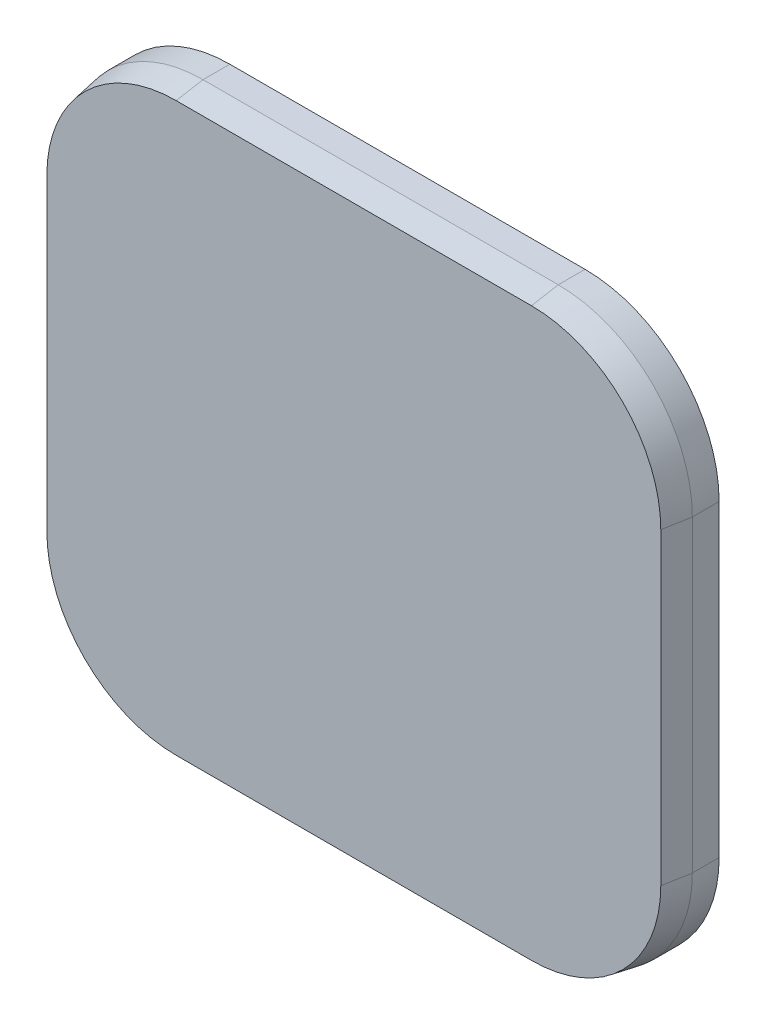
ISO-10303-21;
HEADER;
FILE_DESCRIPTION(('STEP AP214'),'2;1');
FILE_NAME('part.step','',(''),(''),'','','');
FILE_SCHEMA(('AUTOMOTIVE_DESIGN { 1 0 10303 214 1 1 1 1 }'));
ENDSEC;
DATA;
#1=APPLICATION_CONTEXT('core data for automotive mechanical design processes');
#2=APPLICATION_PROTOCOL_DEFINITION('international standard','automotive_design',2000,#1);
#3=PRODUCT_CONTEXT('',#1,'mechanical');
#4=PRODUCT('Part','Part','',(#3));
#5=PRODUCT_RELATED_PRODUCT_CATEGORY('part','',(#4));
#6=PRODUCT_DEFINITION_FORMATION('','',#4);
#7=PRODUCT_DEFINITION_CONTEXT('part definition',#1,'design');
#8=PRODUCT_DEFINITION('design','',#6,#7);
#9=PRODUCT_DEFINITION_SHAPE('','',#8);
#10=(LENGTH_UNIT() NAMED_UNIT(*) SI_UNIT(.MILLI.,.METRE.));
#11=(NAMED_UNIT(*) PLANE_ANGLE_UNIT() SI_UNIT($,.RADIAN.));
#12=(NAMED_UNIT(*) SI_UNIT($,.STERADIAN.) SOLID_ANGLE_UNIT());
#13=UNCERTAINTY_MEASURE_WITH_UNIT(LENGTH_MEASURE(1.E-05),#10,'distance_accuracy_value','');
#14=(GEOMETRIC_REPRESENTATION_CONTEXT(3) GLOBAL_UNCERTAINTY_ASSIGNED_CONTEXT((#13)) GLOBAL_UNIT_ASSIGNED_CONTEXT((#10,
#11,#12)) REPRESENTATION_CONTEXT('',''));
#15=CARTESIAN_POINT('',(0.,0.,0.));
#16=DIRECTION('',(0.,0.,1.));
#17=DIRECTION('',(1.,0.,0.));
#18=AXIS2_PLACEMENT_3D('',#15,#16,#17);
#19=CARTESIAN_POINT('',(-36.5,33.,0.));
#20=DIRECTION('',(0.,0.,-1.));
#21=DIRECTION('',(1.,0.,0.));
#22=AXIS2_PLACEMENT_3D('',#19,#20,#21);
#23=CONICAL_SURFACE('',#22,10.,0.174532925199433);
#24=CARTESIAN_POINT('',(-36.5,33.,0.));
#25=DIRECTION('',(0.,0.,1.));
#26=DIRECTION('',(1.,0.,0.));
#27=AXIS2_PLACEMENT_3D('',#24,#25,#26);
#28=CIRCLE('',#27,10.);
#29=CARTESIAN_POINT('',(-36.4999999999999,43.,0.));
#30=VERTEX_POINT('',#29);
#31=CARTESIAN_POINT('',(-46.5,32.9999999999999,0.));
#32=VERTEX_POINT('',#31);
#33=EDGE_CURVE('E166',#30,#32,#28,.T.);
#34=ORIENTED_EDGE('',*,*,#33,.T.);
#35=DIRECTION('',(-0.17364817766693,0.,-0.984807753012208));
#36=VECTOR('',#35,1.);
#37=CARTESIAN_POINT('',(-46.5,32.9999999999999,0.));
#38=LINE('',#37,#36);
#39=CARTESIAN_POINT('',(-46.1473460385831,32.9999999999999,2.));
#40=VERTEX_POINT('',#39);
#41=EDGE_CURVE('E11',#40,#32,#38,.T.);
#42=ORIENTED_EDGE('',*,*,#41,.F.);
#43=CARTESIAN_POINT('',(-36.5,33.,2.));
#44=DIRECTION('',(0.,0.,1.));
#45=DIRECTION('',(1.,0.,0.));
#46=AXIS2_PLACEMENT_3D('',#43,#44,#45);
#47=CIRCLE('',#46,9.64734603858307);
#48=CARTESIAN_POINT('',(-36.4999999999999,42.6473460385831,2.));
#49=VERTEX_POINT('',#48);
#50=EDGE_CURVE('E198',#49,#40,#47,.T.);
#51=ORIENTED_EDGE('',*,*,#50,.F.);
#52=DIRECTION('',(0.,0.17364817766693,-0.984807753012208));
#53=VECTOR('',#52,1.);
#54=CARTESIAN_POINT('',(-36.4999999999999,43.,0.));
#55=LINE('',#54,#53);
#56=EDGE_CURVE('E200',#49,#30,#55,.T.);
#57=ORIENTED_EDGE('',*,*,#56,.T.);
#58=EDGE_LOOP('',(#34,#42,#51,#57));
#59=FACE_BOUND('',#58,.T.);
#60=ADVANCED_FACE('F33',(#59),#23,.T.);
#61=CARTESIAN_POINT('',(-46.5,10.0000000000001,0.));
#62=DIRECTION('',(-0.984807753012208,0.,0.17364817766693));
#63=DIRECTION('',(0.17364817766693,0.,0.984807753012208));
#64=AXIS2_PLACEMENT_3D('',#61,#62,#63);
#65=PLANE('',#64);
#66=DIRECTION('',(0.,-1.,0.));
#67=VECTOR('',#66,1.);
#68=CARTESIAN_POINT('',(-46.5,10.0000000000001,0.));
#69=LINE('',#68,#67);
#70=CARTESIAN_POINT('',(-46.5,9.99999999999999,0.));
#71=VERTEX_POINT('',#70);
#72=EDGE_CURVE('E129',#32,#71,#69,.T.);
#73=ORIENTED_EDGE('',*,*,#72,.T.);
#74=DIRECTION('',(-0.17364817766693,0.,-0.984807753012208));
#75=VECTOR('',#74,1.);
#76=CARTESIAN_POINT('',(-46.5,9.99999999999999,0.));
#77=LINE('',#76,#75);
#78=CARTESIAN_POINT('',(-46.1473460385831,9.99999999999999,2.));
#79=VERTEX_POINT('',#78);
#80=EDGE_CURVE('E42',#79,#71,#77,.T.);
#81=ORIENTED_EDGE('',*,*,#80,.F.);
#82=DIRECTION('',(0.,1.,0.));
#83=VECTOR('',#82,1.);
#84=CARTESIAN_POINT('',(-46.1473460385831,10.0000000000001,2.));
#85=LINE('',#84,#83);
#86=EDGE_CURVE('E221',#40,#79,#85,.F.);
#87=ORIENTED_EDGE('',*,*,#86,.F.);
#88=ORIENTED_EDGE('',*,*,#41,.T.);
#89=EDGE_LOOP('',(#73,#81,#87,#88));
#90=FACE_BOUND('',#89,.T.);
#91=ADVANCED_FACE('F35',(#90),#65,.T.);
#92=CARTESIAN_POINT('',(-36.5,9.99999999999999,0.));
#93=DIRECTION('',(0.,0.,-1.));
#94=DIRECTION('',(-1.,0.,0.));
#95=AXIS2_PLACEMENT_3D('',#92,#93,#94);
#96=CONICAL_SURFACE('',#95,10.,0.174532925199433);
#97=CARTESIAN_POINT('',(-36.5,9.99999999999999,0.));
#98=DIRECTION('',(0.,0.,1.));
#99=DIRECTION('',(-1.,0.,0.));
#100=AXIS2_PLACEMENT_3D('',#97,#98,#99);
#101=CIRCLE('',#100,10.);
#102=CARTESIAN_POINT('',(-36.4999999999999,0.,0.));
#103=VERTEX_POINT('',#102);
#104=EDGE_CURVE('E181',#71,#103,#101,.T.);
#105=ORIENTED_EDGE('',*,*,#104,.T.);
#106=DIRECTION('',(0.,-0.17364817766693,-0.984807753012208));
#107=VECTOR('',#106,1.);
#108=CARTESIAN_POINT('',(-36.4999999999999,0.,0.));
#109=LINE('',#108,#107);
#110=CARTESIAN_POINT('',(-36.4999999999999,0.352653961416924,2.));
#111=VERTEX_POINT('',#110);
#112=EDGE_CURVE('E215',#111,#103,#109,.T.);
#113=ORIENTED_EDGE('',*,*,#112,.F.);
#114=CARTESIAN_POINT('',(-36.5,9.99999999999999,2.));
#115=DIRECTION('',(0.,0.,1.));
#116=DIRECTION('',(1.,0.,0.));
#117=AXIS2_PLACEMENT_3D('',#114,#115,#116);
#118=CIRCLE('',#117,9.64734603858307);
#119=EDGE_CURVE('E223',#79,#111,#118,.T.);
#120=ORIENTED_EDGE('',*,*,#119,.F.);
#121=ORIENTED_EDGE('',*,*,#80,.T.);
#122=EDGE_LOOP('',(#105,#113,#120,#121));
#123=FACE_BOUND('',#122,.T.);
#124=ADVANCED_FACE('F252',(#123),#96,.T.);
#125=CARTESIAN_POINT('',(-10.0000000000001,0.,0.));
#126=DIRECTION('',(0.,-0.984807753012208,0.17364817766693));
#127=DIRECTION('',(0.,-0.17364817766693,-0.984807753012208));
#128=AXIS2_PLACEMENT_3D('',#125,#126,#127);
#129=PLANE('',#128);
#130=DIRECTION('',(1.,0.,0.));
#131=VECTOR('',#130,1.);
#132=CARTESIAN_POINT('',(-10.0000000000001,0.,0.));
#133=LINE('',#132,#131);
#134=CARTESIAN_POINT('',(-10.0000000000001,0.,0.));
#135=VERTEX_POINT('',#134);
#136=EDGE_CURVE('E184',#103,#135,#133,.T.);
#137=ORIENTED_EDGE('',*,*,#136,.T.);
#138=DIRECTION('',(0.,-0.17364817766693,-0.984807753012208));
#139=VECTOR('',#138,1.);
#140=CARTESIAN_POINT('',(-10.0000000000001,0.,0.));
#141=LINE('',#140,#139);
#142=CARTESIAN_POINT('',(-10.0000000000001,0.352653961416928,2.));
#143=VERTEX_POINT('',#142);
#144=EDGE_CURVE('E212',#143,#135,#141,.T.);
#145=ORIENTED_EDGE('',*,*,#144,.F.);
#146=DIRECTION('',(-1.,0.,0.));
#147=VECTOR('',#146,1.);
#148=CARTESIAN_POINT('',(-10.0000000000001,0.352653961416928,2.));
#149=LINE('',#148,#147);
#150=EDGE_CURVE('E225',#111,#143,#149,.F.);
#151=ORIENTED_EDGE('',*,*,#150,.F.);
#152=ORIENTED_EDGE('',*,*,#112,.T.);
#153=EDGE_LOOP('',(#137,#145,#151,#152));
#154=FACE_BOUND('',#153,.T.);
#155=ADVANCED_FACE('F256',(#154),#129,.T.);
#156=CARTESIAN_POINT('',(-10.,10.,0.));
#157=DIRECTION('',(0.,0.,-1.));
#158=DIRECTION('',(1.,0.,0.));
#159=AXIS2_PLACEMENT_3D('',#156,#157,#158);
#160=CONICAL_SURFACE('',#159,10.,0.174532925199433);
#161=CARTESIAN_POINT('',(-10.,10.,0.));
#162=DIRECTION('',(0.,0.,1.));
#163=DIRECTION('',(1.,0.,0.));
#164=AXIS2_PLACEMENT_3D('',#161,#162,#163);
#165=CIRCLE('',#164,10.);
#166=CARTESIAN_POINT('',(0.,10.0000000000001,0.));
#167=VERTEX_POINT('',#166);
#168=EDGE_CURVE('E187',#135,#167,#165,.T.);
#169=ORIENTED_EDGE('',*,*,#168,.T.);
#170=DIRECTION('',(0.17364817766693,0.,-0.984807753012208));
#171=VECTOR('',#170,1.);
#172=CARTESIAN_POINT('',(0.,10.0000000000001,0.));
#173=LINE('',#172,#171);
#174=CARTESIAN_POINT('',(-0.35265396141693,10.0000000000001,2.));
#175=VERTEX_POINT('',#174);
#176=EDGE_CURVE('E209',#175,#167,#173,.T.);
#177=ORIENTED_EDGE('',*,*,#176,.F.);
#178=CARTESIAN_POINT('',(-10.,10.,2.));
#179=DIRECTION('',(0.,0.,1.));
#180=DIRECTION('',(1.,0.,0.));
#181=AXIS2_PLACEMENT_3D('',#178,#179,#180);
#182=CIRCLE('',#181,9.64734603858307);
#183=EDGE_CURVE('E227',#143,#175,#182,.T.);
#184=ORIENTED_EDGE('',*,*,#183,.F.);
#185=ORIENTED_EDGE('',*,*,#144,.T.);
#186=EDGE_LOOP('',(#169,#177,#184,#185));
#187=FACE_BOUND('',#186,.T.);
#188=ADVANCED_FACE('F259',(#187),#160,.T.);
#189=CARTESIAN_POINT('',(0.,10.0000000000001,0.));
#190=DIRECTION('',(0.984807753012208,0.,0.17364817766693));
#191=DIRECTION('',(0.17364817766693,0.,-0.984807753012208));
#192=AXIS2_PLACEMENT_3D('',#189,#190,#191);
#193=PLANE('',#192);
#194=DIRECTION('',(0.,1.,0.));
#195=VECTOR('',#194,1.);
#196=CARTESIAN_POINT('',(0.,10.0000000000001,0.));
#197=LINE('',#196,#195);
#198=CARTESIAN_POINT('',(0.,32.9999999999999,0.));
#199=VERTEX_POINT('',#198);
#200=EDGE_CURVE('E190',#167,#199,#197,.T.);
#201=ORIENTED_EDGE('',*,*,#200,.T.);
#202=DIRECTION('',(0.17364817766693,0.,-0.984807753012208));
#203=VECTOR('',#202,1.);
#204=CARTESIAN_POINT('',(0.,32.9999999999999,0.));
#205=LINE('',#204,#203);
#206=CARTESIAN_POINT('',(-0.35265396141693,32.9999999999999,2.));
#207=VERTEX_POINT('',#206);
#208=EDGE_CURVE('E206',#207,#199,#205,.T.);
#209=ORIENTED_EDGE('',*,*,#208,.F.);
#210=DIRECTION('',(0.,-1.,0.));
#211=VECTOR('',#210,1.);
#212=CARTESIAN_POINT('',(-0.35265396141693,10.0000000000001,2.));
#213=LINE('',#212,#211);
#214=EDGE_CURVE('E229',#175,#207,#213,.F.);
#215=ORIENTED_EDGE('',*,*,#214,.F.);
#216=ORIENTED_EDGE('',*,*,#176,.T.);
#217=EDGE_LOOP('',(#201,#209,#215,#216));
#218=FACE_BOUND('',#217,.T.);
#219=ADVANCED_FACE('F236',(#218),#193,.T.);
#220=CARTESIAN_POINT('',(-10.,33.,0.));
#221=DIRECTION('',(0.,0.,-1.));
#222=DIRECTION('',(1.,0.,0.));
#223=AXIS2_PLACEMENT_3D('',#220,#221,#222);
#224=CONICAL_SURFACE('',#223,10.,0.174532925199433);
#225=CARTESIAN_POINT('',(-10.,33.,0.));
#226=DIRECTION('',(0.,0.,1.));
#227=DIRECTION('',(1.,0.,0.));
#228=AXIS2_PLACEMENT_3D('',#225,#226,#227);
#229=CIRCLE('',#228,10.);
#230=CARTESIAN_POINT('',(-10.0000000000001,43.,0.));
#231=VERTEX_POINT('',#230);
#232=EDGE_CURVE('E193',#199,#231,#229,.T.);
#233=ORIENTED_EDGE('',*,*,#232,.T.);
#234=DIRECTION('',(0.,0.17364817766693,-0.984807753012208));
#235=VECTOR('',#234,1.);
#236=CARTESIAN_POINT('',(-10.0000000000001,43.,0.));
#237=LINE('',#236,#235);
#238=CARTESIAN_POINT('',(-10.0000000000001,42.6473460385831,2.));
#239=VERTEX_POINT('',#238);
#240=EDGE_CURVE('E203',#239,#231,#237,.T.);
#241=ORIENTED_EDGE('',*,*,#240,.F.);
#242=CARTESIAN_POINT('',(-10.,33.,2.));
#243=DIRECTION('',(0.,0.,1.));
#244=DIRECTION('',(1.,0.,0.));
#245=AXIS2_PLACEMENT_3D('',#242,#243,#244);
#246=CIRCLE('',#245,9.64734603858307);
#247=EDGE_CURVE('E54',#207,#239,#246,.T.);
#248=ORIENTED_EDGE('',*,*,#247,.F.);
#249=ORIENTED_EDGE('',*,*,#208,.T.);
#250=EDGE_LOOP('',(#233,#241,#248,#249));
#251=FACE_BOUND('',#250,.T.);
#252=ADVANCED_FACE('F239',(#251),#224,.T.);
#253=CARTESIAN_POINT('',(-10.0000000000001,43.,0.));
#254=DIRECTION('',(0.,0.984807753012208,0.17364817766693));
#255=DIRECTION('',(0.,-0.17364817766693,0.984807753012208));
#256=AXIS2_PLACEMENT_3D('',#253,#254,#255);
#257=PLANE('',#256);
#258=DIRECTION('',(-1.,0.,0.));
#259=VECTOR('',#258,1.);
#260=CARTESIAN_POINT('',(-10.0000000000001,43.,0.));
#261=LINE('',#260,#259);
#262=EDGE_CURVE('E196',#231,#30,#261,.T.);
#263=ORIENTED_EDGE('',*,*,#262,.T.);
#264=ORIENTED_EDGE('',*,*,#56,.F.);
#265=DIRECTION('',(1.,0.,0.));
#266=VECTOR('',#265,1.);
#267=CARTESIAN_POINT('',(-10.0000000000001,42.6473460385831,2.));
#268=LINE('',#267,#266);
#269=EDGE_CURVE('E37',#239,#49,#268,.F.);
#270=ORIENTED_EDGE('',*,*,#269,.F.);
#271=ORIENTED_EDGE('',*,*,#240,.T.);
#272=EDGE_LOOP('',(#263,#264,#270,#271));
#273=FACE_BOUND('',#272,.T.);
#274=ADVANCED_FACE('F242',(#273),#257,.T.);
#275=CARTESIAN_POINT('',(-36.5,33.,2.));
#276=DIRECTION('',(0.,0.,1.));
#277=DIRECTION('',(1.,0.,0.));
#278=AXIS2_PLACEMENT_3D('',#275,#276,#277);
#279=PLANE('',#278);
#280=ORIENTED_EDGE('',*,*,#50,.T.);
#281=ORIENTED_EDGE('',*,*,#86,.T.);
#282=ORIENTED_EDGE('',*,*,#119,.T.);
#283=ORIENTED_EDGE('',*,*,#150,.T.);
#284=ORIENTED_EDGE('',*,*,#183,.T.);
#285=ORIENTED_EDGE('',*,*,#214,.T.);
#286=ORIENTED_EDGE('',*,*,#247,.T.);
#287=ORIENTED_EDGE('',*,*,#269,.T.);
#288=EDGE_LOOP('',(#280,#281,#282,#283,#284,#285,#286,#287));
#289=FACE_BOUND('',#288,.T.);
#290=ADVANCED_FACE('F232',(#289),#279,.T.);
#291=CARTESIAN_POINT('',(-36.5,33.,-2.));
#292=DIRECTION('',(0.,0.,1.));
#293=DIRECTION('',(1.,0.,0.));
#294=AXIS2_PLACEMENT_3D('',#291,#292,#293);
#295=CYLINDRICAL_SURFACE('',#294,10.);
#296=ORIENTED_EDGE('',*,*,#33,.F.);
#297=DIRECTION('',(0.,0.,1.));
#298=VECTOR('',#297,1.);
#299=CARTESIAN_POINT('',(-36.4999999999999,43.,-2.));
#300=LINE('',#299,#298);
#301=CARTESIAN_POINT('',(-36.4999999999999,43.,-2.));
#302=VERTEX_POINT('',#301);
#303=EDGE_CURVE('E148',#302,#30,#300,.T.);
#304=ORIENTED_EDGE('',*,*,#303,.F.);
#305=CARTESIAN_POINT('',(-36.5,33.,-2.));
#306=DIRECTION('',(0.,0.,1.));
#307=DIRECTION('',(1.,0.,0.));
#308=AXIS2_PLACEMENT_3D('',#305,#306,#307);
#309=CIRCLE('',#308,10.);
#310=CARTESIAN_POINT('',(-46.5,32.9999999999999,-2.));
#311=VERTEX_POINT('',#310);
#312=EDGE_CURVE('E141',#302,#311,#309,.T.);
#313=ORIENTED_EDGE('',*,*,#312,.T.);
#314=DIRECTION('',(0.,0.,1.));
#315=VECTOR('',#314,1.);
#316=CARTESIAN_POINT('',(-46.5,32.9999999999999,-2.));
#317=LINE('',#316,#315);
#318=EDGE_CURVE('E123',#311,#32,#317,.T.);
#319=ORIENTED_EDGE('',*,*,#318,.T.);
#320=EDGE_LOOP('',(#296,#304,#313,#319));
#321=FACE_BOUND('',#320,.T.);
#322=ADVANCED_FACE('F147',(#321),#295,.T.);
#323=CARTESIAN_POINT('',(-10.0000000000001,43.,-2.));
#324=DIRECTION('',(0.,1.,0.));
#325=DIRECTION('',(-1.,0.,0.));
#326=AXIS2_PLACEMENT_3D('',#323,#324,#325);
#327=PLANE('',#326);
#328=ORIENTED_EDGE('',*,*,#262,.F.);
#329=DIRECTION('',(0.,0.,1.));
#330=VECTOR('',#329,1.);
#331=CARTESIAN_POINT('',(-10.0000000000001,43.,-2.));
#332=LINE('',#331,#330);
#333=CARTESIAN_POINT('',(-10.0000000000001,43.,-2.));
#334=VERTEX_POINT('',#333);
#335=EDGE_CURVE('E167',#334,#231,#332,.T.);
#336=ORIENTED_EDGE('',*,*,#335,.F.);
#337=DIRECTION('',(-1.,0.,0.));
#338=VECTOR('',#337,1.);
#339=CARTESIAN_POINT('',(-10.0000000000001,43.,-2.));
#340=LINE('',#339,#338);
#341=EDGE_CURVE('E134',#334,#302,#340,.T.);
#342=ORIENTED_EDGE('',*,*,#341,.T.);
#343=ORIENTED_EDGE('',*,*,#303,.T.);
#344=EDGE_LOOP('',(#328,#336,#342,#343));
#345=FACE_BOUND('',#344,.T.);
#346=ADVANCED_FACE('F271',(#345),#327,.T.);
#347=CARTESIAN_POINT('',(-10.,33.,-2.));
#348=DIRECTION('',(0.,0.,1.));
#349=DIRECTION('',(1.,0.,0.));
#350=AXIS2_PLACEMENT_3D('',#347,#348,#349);
#351=CYLINDRICAL_SURFACE('',#350,10.);
#352=ORIENTED_EDGE('',*,*,#232,.F.);
#353=DIRECTION('',(0.,0.,1.));
#354=VECTOR('',#353,1.);
#355=CARTESIAN_POINT('',(0.,32.9999999999999,-2.));
#356=LINE('',#355,#354);
#357=CARTESIAN_POINT('',(0.,32.9999999999999,-2.));
#358=VERTEX_POINT('',#357);
#359=EDGE_CURVE('E169',#358,#199,#356,.T.);
#360=ORIENTED_EDGE('',*,*,#359,.F.);
#361=CARTESIAN_POINT('',(-10.,33.,-2.));
#362=DIRECTION('',(0.,0.,1.));
#363=DIRECTION('',(1.,0.,0.));
#364=AXIS2_PLACEMENT_3D('',#361,#362,#363);
#365=CIRCLE('',#364,10.);
#366=EDGE_CURVE('E161',#358,#334,#365,.T.);
#367=ORIENTED_EDGE('',*,*,#366,.T.);
#368=ORIENTED_EDGE('',*,*,#335,.T.);
#369=EDGE_LOOP('',(#352,#360,#367,#368));
#370=FACE_BOUND('',#369,.T.);
#371=ADVANCED_FACE('F269',(#370),#351,.T.);
#372=CARTESIAN_POINT('',(0.,10.0000000000001,-2.));
#373=DIRECTION('',(1.,0.,0.));
#374=DIRECTION('',(0.,0.,-1.));
#375=AXIS2_PLACEMENT_3D('',#372,#373,#374);
#376=PLANE('',#375);
#377=ORIENTED_EDGE('',*,*,#200,.F.);
#378=DIRECTION('',(0.,0.,1.));
#379=VECTOR('',#378,1.);
#380=CARTESIAN_POINT('',(0.,10.0000000000001,-2.));
#381=LINE('',#380,#379);
#382=CARTESIAN_POINT('',(0.,10.0000000000001,-2.));
#383=VERTEX_POINT('',#382);
#384=EDGE_CURVE('E171',#383,#167,#381,.T.);
#385=ORIENTED_EDGE('',*,*,#384,.F.);
#386=DIRECTION('',(0.,1.,0.));
#387=VECTOR('',#386,1.);
#388=CARTESIAN_POINT('',(0.,10.0000000000001,-2.));
#389=LINE('',#388,#387);
#390=EDGE_CURVE('E158',#383,#358,#389,.T.);
#391=ORIENTED_EDGE('',*,*,#390,.T.);
#392=ORIENTED_EDGE('',*,*,#359,.T.);
#393=EDGE_LOOP('',(#377,#385,#391,#392));
#394=FACE_BOUND('',#393,.T.);
#395=ADVANCED_FACE('F266',(#394),#376,.T.);
#396=CARTESIAN_POINT('',(-10.,10.,-2.));
#397=DIRECTION('',(0.,0.,1.));
#398=DIRECTION('',(1.,0.,0.));
#399=AXIS2_PLACEMENT_3D('',#396,#397,#398);
#400=CYLINDRICAL_SURFACE('',#399,10.);
#401=ORIENTED_EDGE('',*,*,#168,.F.);
#402=DIRECTION('',(0.,0.,1.));
#403=VECTOR('',#402,1.);
#404=CARTESIAN_POINT('',(-10.0000000000001,0.,-2.));
#405=LINE('',#404,#403);
#406=CARTESIAN_POINT('',(-10.0000000000001,0.,-2.));
#407=VERTEX_POINT('',#406);
#408=EDGE_CURVE('E173',#407,#135,#405,.T.);
#409=ORIENTED_EDGE('',*,*,#408,.F.);
#410=CARTESIAN_POINT('',(-10.,10.,-2.));
#411=DIRECTION('',(0.,0.,1.));
#412=DIRECTION('',(1.,0.,0.));
#413=AXIS2_PLACEMENT_3D('',#410,#411,#412);
#414=CIRCLE('',#413,10.);
#415=EDGE_CURVE('E155',#407,#383,#414,.T.);
#416=ORIENTED_EDGE('',*,*,#415,.T.);
#417=ORIENTED_EDGE('',*,*,#384,.T.);
#418=EDGE_LOOP('',(#401,#409,#416,#417));
#419=FACE_BOUND('',#418,.T.);
#420=ADVANCED_FACE('F262',(#419),#400,.T.);
#421=CARTESIAN_POINT('',(-10.0000000000001,0.,-2.));
#422=DIRECTION('',(0.,-1.,0.));
#423=DIRECTION('',(1.,0.,0.));
#424=AXIS2_PLACEMENT_3D('',#421,#422,#423);
#425=PLANE('',#424);
#426=ORIENTED_EDGE('',*,*,#136,.F.);
#427=DIRECTION('',(0.,0.,1.));
#428=VECTOR('',#427,1.);
#429=CARTESIAN_POINT('',(-36.4999999999999,0.,-2.));
#430=LINE('',#429,#428);
#431=CARTESIAN_POINT('',(-36.4999999999999,0.,-2.));
#432=VERTEX_POINT('',#431);
#433=EDGE_CURVE('E175',#432,#103,#430,.T.);
#434=ORIENTED_EDGE('',*,*,#433,.F.);
#435=DIRECTION('',(1.,0.,0.));
#436=VECTOR('',#435,1.);
#437=CARTESIAN_POINT('',(-10.0000000000001,0.,-2.));
#438=LINE('',#437,#436);
#439=EDGE_CURVE('E152',#432,#407,#438,.T.);
#440=ORIENTED_EDGE('',*,*,#439,.T.);
#441=ORIENTED_EDGE('',*,*,#408,.T.);
#442=EDGE_LOOP('',(#426,#434,#440,#441));
#443=FACE_BOUND('',#442,.T.);
#444=ADVANCED_FACE('F273',(#443),#425,.T.);
#445=CARTESIAN_POINT('',(-36.5,9.99999999999999,-2.));
#446=DIRECTION('',(0.,0.,1.));
#447=DIRECTION('',(1.,0.,0.));
#448=AXIS2_PLACEMENT_3D('',#445,#446,#447);
#449=CYLINDRICAL_SURFACE('',#448,10.);
#450=ORIENTED_EDGE('',*,*,#104,.F.);
#451=DIRECTION('',(0.,0.,1.));
#452=VECTOR('',#451,1.);
#453=CARTESIAN_POINT('',(-46.5,9.99999999999999,-2.));
#454=LINE('',#453,#452);
#455=CARTESIAN_POINT('',(-46.5,9.99999999999999,-2.));
#456=VERTEX_POINT('',#455);
#457=EDGE_CURVE('E133',#456,#71,#454,.T.);
#458=ORIENTED_EDGE('',*,*,#457,.F.);
#459=CARTESIAN_POINT('',(-36.5,9.99999999999999,-2.));
#460=DIRECTION('',(0.,0.,1.));
#461=DIRECTION('',(-1.,0.,0.));
#462=AXIS2_PLACEMENT_3D('',#459,#460,#461);
#463=CIRCLE('',#462,10.);
#464=EDGE_CURVE('E145',#456,#432,#463,.T.);
#465=ORIENTED_EDGE('',*,*,#464,.T.);
#466=ORIENTED_EDGE('',*,*,#433,.T.);
#467=EDGE_LOOP('',(#450,#458,#465,#466));
#468=FACE_BOUND('',#467,.T.);
#469=ADVANCED_FACE('F275',(#468),#449,.T.);
#470=CARTESIAN_POINT('',(-46.5,10.0000000000001,-2.));
#471=DIRECTION('',(-1.,0.,0.));
#472=DIRECTION('',(0.,0.,1.));
#473=AXIS2_PLACEMENT_3D('',#470,#471,#472);
#474=PLANE('',#473);
#475=ORIENTED_EDGE('',*,*,#72,.F.);
#476=ORIENTED_EDGE('',*,*,#318,.F.);
#477=DIRECTION('',(0.,-1.,0.));
#478=VECTOR('',#477,1.);
#479=CARTESIAN_POINT('',(-46.5,10.0000000000001,-2.));
#480=LINE('',#479,#478);
#481=EDGE_CURVE('E127',#311,#456,#480,.T.);
#482=ORIENTED_EDGE('',*,*,#481,.T.);
#483=ORIENTED_EDGE('',*,*,#457,.T.);
#484=EDGE_LOOP('',(#475,#476,#482,#483));
#485=FACE_BOUND('',#484,.T.);
#486=ADVANCED_FACE('F125',(#485),#474,.T.);
#487=CARTESIAN_POINT('',(-36.5,33.,-2.));
#488=DIRECTION('',(0.,0.,1.));
#489=DIRECTION('',(1.,0.,0.));
#490=AXIS2_PLACEMENT_3D('',#487,#488,#489);
#491=PLANE('',#490);
#492=ORIENTED_EDGE('',*,*,#312,.F.);
#493=ORIENTED_EDGE('',*,*,#341,.F.);
#494=ORIENTED_EDGE('',*,*,#366,.F.);
#495=ORIENTED_EDGE('',*,*,#390,.F.);
#496=ORIENTED_EDGE('',*,*,#415,.F.);
#497=ORIENTED_EDGE('',*,*,#439,.F.);
#498=ORIENTED_EDGE('',*,*,#464,.F.);
#499=ORIENTED_EDGE('',*,*,#481,.F.);
#500=EDGE_LOOP('',(#492,#493,#494,#495,#496,#497,#498,#499));
#501=FACE_BOUND('',#500,.T.);
#502=ADVANCED_FACE('F139',(#501),#491,.F.);
#503=CLOSED_SHELL('',(#60,#91,#124,#155,#188,#219,#252,#274,#290,#322,#346,#371,#395,#420,#444,
#469,#486,#502));
#504=MANIFOLD_SOLID_BREP('B2',#503);
#505=ADVANCED_BREP_SHAPE_REPRESENTATION('',(#18,#504),#14);
#506=SHAPE_DEFINITION_REPRESENTATION(#9,#505);
ENDSEC;
END-ISO-10303-21;
